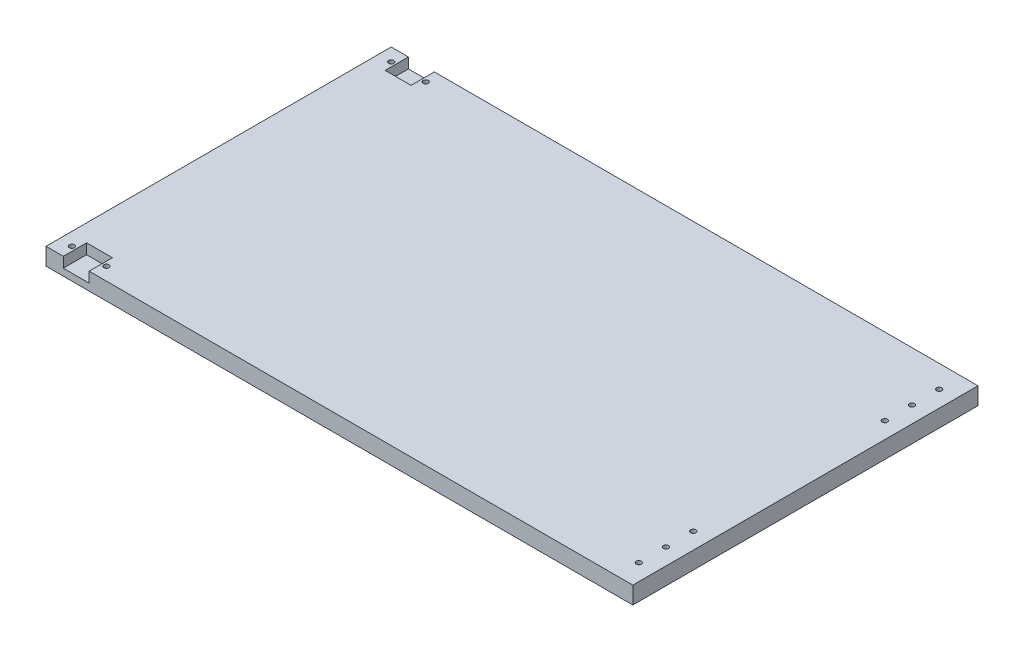
ISO-10303-21;
HEADER;
FILE_DESCRIPTION(('STEP AP214'),'2;1');
FILE_NAME('part.step','',(''),(''),'','','');
FILE_SCHEMA(('AUTOMOTIVE_DESIGN { 1 0 10303 214 1 1 1 1 }'));
ENDSEC;
DATA;
#1=APPLICATION_CONTEXT('core data for automotive mechanical design processes');
#2=APPLICATION_PROTOCOL_DEFINITION('international standard','automotive_design',2000,#1);
#3=PRODUCT_CONTEXT('',#1,'mechanical');
#4=PRODUCT('Part','Part','',(#3));
#5=PRODUCT_RELATED_PRODUCT_CATEGORY('part','',(#4));
#6=PRODUCT_DEFINITION_FORMATION('','',#4);
#7=PRODUCT_DEFINITION_CONTEXT('part definition',#1,'design');
#8=PRODUCT_DEFINITION('design','',#6,#7);
#9=PRODUCT_DEFINITION_SHAPE('','',#8);
#10=(LENGTH_UNIT() NAMED_UNIT(*) SI_UNIT(.MILLI.,.METRE.));
#11=(NAMED_UNIT(*) PLANE_ANGLE_UNIT() SI_UNIT($,.RADIAN.));
#12=(NAMED_UNIT(*) SI_UNIT($,.STERADIAN.) SOLID_ANGLE_UNIT());
#13=UNCERTAINTY_MEASURE_WITH_UNIT(LENGTH_MEASURE(1.E-05),#10,'distance_accuracy_value','');
#14=(GEOMETRIC_REPRESENTATION_CONTEXT(3) GLOBAL_UNCERTAINTY_ASSIGNED_CONTEXT((#13)) GLOBAL_UNIT_ASSIGNED_CONTEXT((#10,
#11,#12)) REPRESENTATION_CONTEXT('',''));
#15=CARTESIAN_POINT('',(0.,0.,0.));
#16=DIRECTION('',(0.,0.,1.));
#17=DIRECTION('',(1.,0.,0.));
#18=AXIS2_PLACEMENT_3D('',#15,#16,#17);
#19=CARTESIAN_POINT('',(-340.,20.,-200.));
#20=DIRECTION('',(0.,0.,1.));
#21=DIRECTION('',(1.,0.,0.));
#22=AXIS2_PLACEMENT_3D('',#19,#20,#21);
#23=PLANE('',#22);
#24=DIRECTION('',(0.,1.,0.));
#25=VECTOR('',#24,1.);
#26=CARTESIAN_POINT('',(-320.,8.,-200.));
#27=LINE('',#26,#25);
#28=CARTESIAN_POINT('',(-320.,8.,-200.));
#29=VERTEX_POINT('',#28);
#30=CARTESIAN_POINT('',(-320.,20.,-200.));
#31=VERTEX_POINT('',#30);
#32=EDGE_CURVE('E163',#29,#31,#27,.T.);
#33=ORIENTED_EDGE('',*,*,#32,.F.);
#34=DIRECTION('',(1.,0.,0.));
#35=VECTOR('',#34,1.);
#36=CARTESIAN_POINT('',(-320.,8.,-200.));
#37=LINE('',#36,#35);
#38=CARTESIAN_POINT('',(-290.,8.,-200.));
#39=VERTEX_POINT('',#38);
#40=EDGE_CURVE('E145',#29,#39,#37,.T.);
#41=ORIENTED_EDGE('',*,*,#40,.T.);
#42=DIRECTION('',(0.,1.,0.));
#43=VECTOR('',#42,1.);
#44=CARTESIAN_POINT('',(-290.,8.,-200.));
#45=LINE('',#44,#43);
#46=CARTESIAN_POINT('',(-290.,20.,-200.));
#47=VERTEX_POINT('',#46);
#48=EDGE_CURVE('E166',#39,#47,#45,.T.);
#49=ORIENTED_EDGE('',*,*,#48,.T.);
#50=DIRECTION('',(-1.,0.,0.));
#51=VECTOR('',#50,1.);
#52=CARTESIAN_POINT('',(-340.,20.,-200.));
#53=LINE('',#52,#51);
#54=CARTESIAN_POINT('',(340.,20.,-200.));
#55=VERTEX_POINT('',#54);
#56=EDGE_CURVE('E202',#55,#47,#53,.T.);
#57=ORIENTED_EDGE('',*,*,#56,.F.);
#58=DIRECTION('',(0.,-1.,0.));
#59=VECTOR('',#58,1.);
#60=CARTESIAN_POINT('',(340.,20.,-200.));
#61=LINE('',#60,#59);
#62=CARTESIAN_POINT('',(340.,0.,-200.));
#63=VERTEX_POINT('',#62);
#64=EDGE_CURVE('E11',#55,#63,#61,.T.);
#65=ORIENTED_EDGE('',*,*,#64,.T.);
#66=DIRECTION('',(-1.,0.,0.));
#67=VECTOR('',#66,1.);
#68=CARTESIAN_POINT('',(-340.,0.,-200.));
#69=LINE('',#68,#67);
#70=CARTESIAN_POINT('',(-340.,0.,-200.));
#71=VERTEX_POINT('',#70);
#72=EDGE_CURVE('E214',#63,#71,#69,.T.);
#73=ORIENTED_EDGE('',*,*,#72,.T.);
#74=DIRECTION('',(0.,-1.,0.));
#75=VECTOR('',#74,1.);
#76=CARTESIAN_POINT('',(-340.,20.,-200.));
#77=LINE('',#76,#75);
#78=CARTESIAN_POINT('',(-340.,20.,-200.));
#79=VERTEX_POINT('',#78);
#80=EDGE_CURVE('E47',#79,#71,#77,.T.);
#81=ORIENTED_EDGE('',*,*,#80,.F.);
#82=EDGE_CURVE('E200',#31,#79,#53,.T.);
#83=ORIENTED_EDGE('',*,*,#82,.F.);
#84=EDGE_LOOP('',(#33,#41,#49,#57,#65,#73,#81,#83));
#85=FACE_BOUND('',#84,.T.);
#86=ADVANCED_FACE('F39',(#85),#23,.F.);
#87=CARTESIAN_POINT('',(0.,20.,0.));
#88=DIRECTION('',(0.,1.,0.));
#89=DIRECTION('',(0.,0.,1.));
#90=AXIS2_PLACEMENT_3D('',#87,#88,#89);
#91=PLANE('',#90);
#92=CARTESIAN_POINT('',(-325.,20.,-185.));
#93=DIRECTION('',(0.,-1.,0.));
#94=DIRECTION('',(0.,0.,-1.));
#95=AXIS2_PLACEMENT_3D('',#92,#93,#94);
#96=CIRCLE('',#95,2.99999999999999);
#97=CARTESIAN_POINT('',(-325.,20.,-188.));
#98=VERTEX_POINT('',#97);
#99=EDGE_CURVE('E657',#98,#98,#96,.T.);
#100=ORIENTED_EDGE('',*,*,#99,.T.);
#101=EDGE_LOOP('',(#100));
#102=FACE_BOUND('',#101,.T.);
#103=CARTESIAN_POINT('',(-285.,20.,-185.));
#104=DIRECTION('',(0.,-1.,0.));
#105=DIRECTION('',(0.,0.,-1.));
#106=AXIS2_PLACEMENT_3D('',#103,#104,#105);
#107=CIRCLE('',#106,2.99999999999999);
#108=CARTESIAN_POINT('',(-285.,20.,-188.));
#109=VERTEX_POINT('',#108);
#110=EDGE_CURVE('E668',#109,#109,#107,.T.);
#111=ORIENTED_EDGE('',*,*,#110,.T.);
#112=EDGE_LOOP('',(#111));
#113=FACE_BOUND('',#112,.T.);
#114=CARTESIAN_POINT('',(-325.,20.,185.));
#115=DIRECTION('',(0.,1.,0.));
#116=DIRECTION('',(0.,0.,1.));
#117=AXIS2_PLACEMENT_3D('',#114,#115,#116);
#118=CIRCLE('',#117,2.99999999999999);
#119=CARTESIAN_POINT('',(-325.,20.,188.));
#120=VERTEX_POINT('',#119);
#121=EDGE_CURVE('E675',#120,#120,#118,.T.);
#122=ORIENTED_EDGE('',*,*,#121,.F.);
#123=EDGE_LOOP('',(#122));
#124=FACE_BOUND('',#123,.T.);
#125=CARTESIAN_POINT('',(-285.,20.,185.));
#126=DIRECTION('',(0.,1.,0.));
#127=DIRECTION('',(0.,0.,1.));
#128=AXIS2_PLACEMENT_3D('',#125,#126,#127);
#129=CIRCLE('',#128,2.99999999999999);
#130=CARTESIAN_POINT('',(-285.,20.,188.));
#131=VERTEX_POINT('',#130);
#132=EDGE_CURVE('E660',#131,#131,#129,.T.);
#133=ORIENTED_EDGE('',*,*,#132,.F.);
#134=EDGE_LOOP('',(#133));
#135=FACE_BOUND('',#134,.T.);
#136=CARTESIAN_POINT('',(321.,20.,-174.));
#137=DIRECTION('',(0.,-1.,0.));
#138=DIRECTION('',(0.,0.,-1.));
#139=AXIS2_PLACEMENT_3D('',#136,#137,#138);
#140=CIRCLE('',#139,2.99999999999999);
#141=CARTESIAN_POINT('',(321.,20.,-177.));
#142=VERTEX_POINT('',#141);
#143=EDGE_CURVE('E683',#142,#142,#140,.T.);
#144=ORIENTED_EDGE('',*,*,#143,.T.);
#145=EDGE_LOOP('',(#144));
#146=FACE_BOUND('',#145,.T.);
#147=CARTESIAN_POINT('',(321.,20.,-142.5));
#148=DIRECTION('',(0.,-1.,0.));
#149=DIRECTION('',(0.,0.,-1.));
#150=AXIS2_PLACEMENT_3D('',#147,#148,#149);
#151=CIRCLE('',#150,2.99999999999999);
#152=CARTESIAN_POINT('',(321.,20.,-145.5));
#153=VERTEX_POINT('',#152);
#154=EDGE_CURVE('E689',#153,#153,#151,.T.);
#155=ORIENTED_EDGE('',*,*,#154,.T.);
#156=EDGE_LOOP('',(#155));
#157=FACE_BOUND('',#156,.T.);
#158=CARTESIAN_POINT('',(321.,20.,-111.));
#159=DIRECTION('',(0.,-1.,0.));
#160=DIRECTION('',(0.,0.,-1.));
#161=AXIS2_PLACEMENT_3D('',#158,#159,#160);
#162=CIRCLE('',#161,2.99999999999999);
#163=CARTESIAN_POINT('',(321.,20.,-114.));
#164=VERTEX_POINT('',#163);
#165=EDGE_CURVE('E674',#164,#164,#162,.T.);
#166=ORIENTED_EDGE('',*,*,#165,.T.);
#167=EDGE_LOOP('',(#166));
#168=FACE_BOUND('',#167,.T.);
#169=CARTESIAN_POINT('',(321.,20.,174.));
#170=DIRECTION('',(0.,1.,0.));
#171=DIRECTION('',(0.,0.,1.));
#172=AXIS2_PLACEMENT_3D('',#169,#170,#171);
#173=CIRCLE('',#172,2.99999999999999);
#174=CARTESIAN_POINT('',(321.,20.,177.));
#175=VERTEX_POINT('',#174);
#176=EDGE_CURVE('E699',#175,#175,#173,.T.);
#177=ORIENTED_EDGE('',*,*,#176,.F.);
#178=EDGE_LOOP('',(#177));
#179=FACE_BOUND('',#178,.T.);
#180=CARTESIAN_POINT('',(321.,20.,142.5));
#181=DIRECTION('',(0.,1.,0.));
#182=DIRECTION('',(0.,0.,1.));
#183=AXIS2_PLACEMENT_3D('',#180,#181,#182);
#184=CIRCLE('',#183,2.99999999999999);
#185=CARTESIAN_POINT('',(321.,20.,145.5));
#186=VERTEX_POINT('',#185);
#187=EDGE_CURVE('E702',#186,#186,#184,.T.);
#188=ORIENTED_EDGE('',*,*,#187,.F.);
#189=EDGE_LOOP('',(#188));
#190=FACE_BOUND('',#189,.T.);
#191=CARTESIAN_POINT('',(321.,20.,111.));
#192=DIRECTION('',(0.,1.,0.));
#193=DIRECTION('',(0.,0.,1.));
#194=AXIS2_PLACEMENT_3D('',#191,#192,#193);
#195=CIRCLE('',#194,2.99999999999999);
#196=CARTESIAN_POINT('',(321.,20.,114.));
#197=VERTEX_POINT('',#196);
#198=EDGE_CURVE('E707',#197,#197,#195,.T.);
#199=ORIENTED_EDGE('',*,*,#198,.F.);
#200=EDGE_LOOP('',(#199));
#201=FACE_BOUND('',#200,.T.);
#202=DIRECTION('',(-1.,0.,0.));
#203=VECTOR('',#202,1.);
#204=CARTESIAN_POINT('',(-320.,20.,-173.));
#205=LINE('',#204,#203);
#206=CARTESIAN_POINT('',(-290.,20.,-173.));
#207=VERTEX_POINT('',#206);
#208=CARTESIAN_POINT('',(-320.,20.,-173.));
#209=VERTEX_POINT('',#208);
#210=EDGE_CURVE('E152',#207,#209,#205,.T.);
#211=ORIENTED_EDGE('',*,*,#210,.T.);
#212=DIRECTION('',(0.,0.,-1.));
#213=VECTOR('',#212,1.);
#214=CARTESIAN_POINT('',(-320.,20.,-200.));
#215=LINE('',#214,#213);
#216=EDGE_CURVE('E54',#209,#31,#215,.T.);
#217=ORIENTED_EDGE('',*,*,#216,.T.);
#218=ORIENTED_EDGE('',*,*,#82,.T.);
#219=DIRECTION('',(0.,0.,1.));
#220=VECTOR('',#219,1.);
#221=CARTESIAN_POINT('',(-340.,20.,-200.));
#222=LINE('',#221,#220);
#223=CARTESIAN_POINT('',(-340.,20.,200.));
#224=VERTEX_POINT('',#223);
#225=EDGE_CURVE('E205',#79,#224,#222,.T.);
#226=ORIENTED_EDGE('',*,*,#225,.T.);
#227=DIRECTION('',(1.,0.,0.));
#228=VECTOR('',#227,1.);
#229=CARTESIAN_POINT('',(-340.,20.,200.));
#230=LINE('',#229,#228);
#231=CARTESIAN_POINT('',(-320.,20.,200.));
#232=VERTEX_POINT('',#231);
#233=EDGE_CURVE('E208',#224,#232,#230,.T.);
#234=ORIENTED_EDGE('',*,*,#233,.T.);
#235=DIRECTION('',(0.,0.,1.));
#236=VECTOR('',#235,1.);
#237=CARTESIAN_POINT('',(-320.,20.,200.));
#238=LINE('',#237,#236);
#239=CARTESIAN_POINT('',(-320.,20.,173.));
#240=VERTEX_POINT('',#239);
#241=EDGE_CURVE('E165',#240,#232,#238,.T.);
#242=ORIENTED_EDGE('',*,*,#241,.F.);
#243=DIRECTION('',(-1.,0.,0.));
#244=VECTOR('',#243,1.);
#245=CARTESIAN_POINT('',(-320.,20.,173.));
#246=LINE('',#245,#244);
#247=CARTESIAN_POINT('',(-290.,20.,173.));
#248=VERTEX_POINT('',#247);
#249=EDGE_CURVE('E174',#248,#240,#246,.T.);
#250=ORIENTED_EDGE('',*,*,#249,.F.);
#251=DIRECTION('',(0.,0.,-1.));
#252=VECTOR('',#251,1.);
#253=CARTESIAN_POINT('',(-290.,20.,200.));
#254=LINE('',#253,#252);
#255=CARTESIAN_POINT('',(-290.,20.,200.));
#256=VERTEX_POINT('',#255);
#257=EDGE_CURVE('E185',#256,#248,#254,.T.);
#258=ORIENTED_EDGE('',*,*,#257,.F.);
#259=CARTESIAN_POINT('',(340.,20.,200.));
#260=VERTEX_POINT('',#259);
#261=EDGE_CURVE('E207',#256,#260,#230,.T.);
#262=ORIENTED_EDGE('',*,*,#261,.T.);
#263=DIRECTION('',(0.,0.,-1.));
#264=VECTOR('',#263,1.);
#265=CARTESIAN_POINT('',(340.,20.,-200.));
#266=LINE('',#265,#264);
#267=EDGE_CURVE('E197',#260,#55,#266,.T.);
#268=ORIENTED_EDGE('',*,*,#267,.T.);
#269=ORIENTED_EDGE('',*,*,#56,.T.);
#270=DIRECTION('',(0.,0.,1.));
#271=VECTOR('',#270,1.);
#272=CARTESIAN_POINT('',(-290.,20.,-200.));
#273=LINE('',#272,#271);
#274=EDGE_CURVE('E149',#47,#207,#273,.T.);
#275=ORIENTED_EDGE('',*,*,#274,.T.);
#276=EDGE_LOOP('',(#211,#217,#218,#226,#234,#242,#250,#258,#262,#268,#269,#275));
#277=FACE_BOUND('',#276,.T.);
#278=ADVANCED_FACE('F246',(#102,#113,#124,#135,#146,#157,#168,#179,#190,#201,#277),#91,.T.);
#279=CARTESIAN_POINT('',(340.,20.,-200.));
#280=DIRECTION('',(-1.,0.,0.));
#281=DIRECTION('',(0.,0.,1.));
#282=AXIS2_PLACEMENT_3D('',#279,#280,#281);
#283=PLANE('',#282);
#284=DIRECTION('',(0.,0.,-1.));
#285=VECTOR('',#284,1.);
#286=CARTESIAN_POINT('',(340.,0.,-200.));
#287=LINE('',#286,#285);
#288=CARTESIAN_POINT('',(340.,0.,200.));
#289=VERTEX_POINT('',#288);
#290=EDGE_CURVE('E191',#289,#63,#287,.T.);
#291=ORIENTED_EDGE('',*,*,#290,.T.);
#292=ORIENTED_EDGE('',*,*,#64,.F.);
#293=ORIENTED_EDGE('',*,*,#267,.F.);
#294=DIRECTION('',(0.,-1.,0.));
#295=VECTOR('',#294,1.);
#296=CARTESIAN_POINT('',(340.,20.,200.));
#297=LINE('',#296,#295);
#298=EDGE_CURVE('E211',#260,#289,#297,.T.);
#299=ORIENTED_EDGE('',*,*,#298,.T.);
#300=EDGE_LOOP('',(#291,#292,#293,#299));
#301=FACE_BOUND('',#300,.T.);
#302=ADVANCED_FACE('F41',(#301),#283,.F.);
#303=CARTESIAN_POINT('',(-340.,20.,-200.));
#304=DIRECTION('',(1.,0.,0.));
#305=DIRECTION('',(0.,0.,-1.));
#306=AXIS2_PLACEMENT_3D('',#303,#304,#305);
#307=PLANE('',#306);
#308=DIRECTION('',(0.,0.,1.));
#309=VECTOR('',#308,1.);
#310=CARTESIAN_POINT('',(-340.,0.,-200.));
#311=LINE('',#310,#309);
#312=CARTESIAN_POINT('',(-340.,0.,200.));
#313=VERTEX_POINT('',#312);
#314=EDGE_CURVE('E216',#71,#313,#311,.T.);
#315=ORIENTED_EDGE('',*,*,#314,.T.);
#316=DIRECTION('',(0.,-1.,0.));
#317=VECTOR('',#316,1.);
#318=CARTESIAN_POINT('',(-340.,20.,200.));
#319=LINE('',#318,#317);
#320=EDGE_CURVE('E221',#224,#313,#319,.T.);
#321=ORIENTED_EDGE('',*,*,#320,.F.);
#322=ORIENTED_EDGE('',*,*,#225,.F.);
#323=ORIENTED_EDGE('',*,*,#80,.T.);
#324=EDGE_LOOP('',(#315,#321,#322,#323));
#325=FACE_BOUND('',#324,.T.);
#326=ADVANCED_FACE('F228',(#325),#307,.F.);
#327=CARTESIAN_POINT('',(-340.,20.,200.));
#328=DIRECTION('',(0.,0.,-1.));
#329=DIRECTION('',(-1.,0.,0.));
#330=AXIS2_PLACEMENT_3D('',#327,#328,#329);
#331=PLANE('',#330);
#332=DIRECTION('',(1.,0.,0.));
#333=VECTOR('',#332,1.);
#334=CARTESIAN_POINT('',(-320.,8.,200.));
#335=LINE('',#334,#333);
#336=CARTESIAN_POINT('',(-320.,8.,200.));
#337=VERTEX_POINT('',#336);
#338=CARTESIAN_POINT('',(-290.,8.,200.));
#339=VERTEX_POINT('',#338);
#340=EDGE_CURVE('E173',#337,#339,#335,.T.);
#341=ORIENTED_EDGE('',*,*,#340,.F.);
#342=DIRECTION('',(0.,1.,0.));
#343=VECTOR('',#342,1.);
#344=CARTESIAN_POINT('',(-320.,8.,200.));
#345=LINE('',#344,#343);
#346=EDGE_CURVE('E183',#337,#232,#345,.T.);
#347=ORIENTED_EDGE('',*,*,#346,.T.);
#348=ORIENTED_EDGE('',*,*,#233,.F.);
#349=ORIENTED_EDGE('',*,*,#320,.T.);
#350=DIRECTION('',(1.,0.,0.));
#351=VECTOR('',#350,1.);
#352=CARTESIAN_POINT('',(-340.,0.,200.));
#353=LINE('',#352,#351);
#354=EDGE_CURVE('E201',#313,#289,#353,.T.);
#355=ORIENTED_EDGE('',*,*,#354,.T.);
#356=ORIENTED_EDGE('',*,*,#298,.F.);
#357=ORIENTED_EDGE('',*,*,#261,.F.);
#358=DIRECTION('',(0.,1.,0.));
#359=VECTOR('',#358,1.);
#360=CARTESIAN_POINT('',(-290.,8.,200.));
#361=LINE('',#360,#359);
#362=EDGE_CURVE('E62',#339,#256,#361,.T.);
#363=ORIENTED_EDGE('',*,*,#362,.F.);
#364=EDGE_LOOP('',(#341,#347,#348,#349,#355,#356,#357,#363));
#365=FACE_BOUND('',#364,.T.);
#366=ADVANCED_FACE('F239',(#365),#331,.F.);
#367=CARTESIAN_POINT('',(0.,0.,0.));
#368=DIRECTION('',(0.,1.,0.));
#369=DIRECTION('',(0.,0.,1.));
#370=AXIS2_PLACEMENT_3D('',#367,#368,#369);
#371=PLANE('',#370);
#372=ORIENTED_EDGE('',*,*,#290,.F.);
#373=ORIENTED_EDGE('',*,*,#354,.F.);
#374=ORIENTED_EDGE('',*,*,#314,.F.);
#375=ORIENTED_EDGE('',*,*,#72,.F.);
#376=EDGE_LOOP('',(#372,#373,#374,#375));
#377=FACE_BOUND('',#376,.T.);
#378=ADVANCED_FACE('F235',(#377),#371,.F.);
#379=CARTESIAN_POINT('',(-320.,8.,200.));
#380=DIRECTION('',(-1.,0.,0.));
#381=DIRECTION('',(0.,0.,1.));
#382=AXIS2_PLACEMENT_3D('',#379,#380,#381);
#383=PLANE('',#382);
#384=ORIENTED_EDGE('',*,*,#241,.T.);
#385=ORIENTED_EDGE('',*,*,#346,.F.);
#386=DIRECTION('',(0.,0.,1.));
#387=VECTOR('',#386,1.);
#388=CARTESIAN_POINT('',(-320.,8.,200.));
#389=LINE('',#388,#387);
#390=CARTESIAN_POINT('',(-320.,8.,173.));
#391=VERTEX_POINT('',#390);
#392=EDGE_CURVE('E170',#391,#337,#389,.T.);
#393=ORIENTED_EDGE('',*,*,#392,.F.);
#394=DIRECTION('',(0.,1.,0.));
#395=VECTOR('',#394,1.);
#396=CARTESIAN_POINT('',(-320.,8.,173.));
#397=LINE('',#396,#395);
#398=EDGE_CURVE('E189',#391,#240,#397,.T.);
#399=ORIENTED_EDGE('',*,*,#398,.T.);
#400=EDGE_LOOP('',(#384,#385,#393,#399));
#401=FACE_BOUND('',#400,.T.);
#402=ADVANCED_FACE('F253',(#401),#383,.F.);
#403=CARTESIAN_POINT('',(-320.,8.,173.));
#404=DIRECTION('',(0.,0.,-1.));
#405=DIRECTION('',(-1.,0.,0.));
#406=AXIS2_PLACEMENT_3D('',#403,#404,#405);
#407=PLANE('',#406);
#408=ORIENTED_EDGE('',*,*,#249,.T.);
#409=ORIENTED_EDGE('',*,*,#398,.F.);
#410=DIRECTION('',(-1.,0.,0.));
#411=VECTOR('',#410,1.);
#412=CARTESIAN_POINT('',(-320.,8.,173.));
#413=LINE('',#412,#411);
#414=CARTESIAN_POINT('',(-290.,8.,173.));
#415=VERTEX_POINT('',#414);
#416=EDGE_CURVE('E180',#415,#391,#413,.T.);
#417=ORIENTED_EDGE('',*,*,#416,.F.);
#418=DIRECTION('',(0.,1.,0.));
#419=VECTOR('',#418,1.);
#420=CARTESIAN_POINT('',(-290.,8.,173.));
#421=LINE('',#420,#419);
#422=EDGE_CURVE('E192',#415,#248,#421,.T.);
#423=ORIENTED_EDGE('',*,*,#422,.T.);
#424=EDGE_LOOP('',(#408,#409,#417,#423));
#425=FACE_BOUND('',#424,.T.);
#426=ADVANCED_FACE('F281',(#425),#407,.F.);
#427=CARTESIAN_POINT('',(-290.,8.,200.));
#428=DIRECTION('',(1.,0.,0.));
#429=DIRECTION('',(0.,0.,-1.));
#430=AXIS2_PLACEMENT_3D('',#427,#428,#429);
#431=PLANE('',#430);
#432=ORIENTED_EDGE('',*,*,#257,.T.);
#433=ORIENTED_EDGE('',*,*,#422,.F.);
#434=DIRECTION('',(0.,0.,-1.));
#435=VECTOR('',#434,1.);
#436=CARTESIAN_POINT('',(-290.,8.,200.));
#437=LINE('',#436,#435);
#438=EDGE_CURVE('E177',#339,#415,#437,.T.);
#439=ORIENTED_EDGE('',*,*,#438,.F.);
#440=ORIENTED_EDGE('',*,*,#362,.T.);
#441=EDGE_LOOP('',(#432,#433,#439,#440));
#442=FACE_BOUND('',#441,.T.);
#443=ADVANCED_FACE('F282',(#442),#431,.F.);
#444=CARTESIAN_POINT('',(0.,8.,0.));
#445=DIRECTION('',(0.,-1.,0.));
#446=DIRECTION('',(0.,0.,-1.));
#447=AXIS2_PLACEMENT_3D('',#444,#445,#446);
#448=PLANE('',#447);
#449=ORIENTED_EDGE('',*,*,#392,.T.);
#450=ORIENTED_EDGE('',*,*,#340,.T.);
#451=ORIENTED_EDGE('',*,*,#438,.T.);
#452=ORIENTED_EDGE('',*,*,#416,.T.);
#453=EDGE_LOOP('',(#449,#450,#451,#452));
#454=FACE_BOUND('',#453,.T.);
#455=ADVANCED_FACE('F249',(#454),#448,.F.);
#456=CARTESIAN_POINT('',(-320.,8.,-200.));
#457=DIRECTION('',(1.,0.,0.));
#458=DIRECTION('',(0.,0.,-1.));
#459=AXIS2_PLACEMENT_3D('',#456,#457,#458);
#460=PLANE('',#459);
#461=ORIENTED_EDGE('',*,*,#216,.F.);
#462=DIRECTION('',(0.,1.,0.));
#463=VECTOR('',#462,1.);
#464=CARTESIAN_POINT('',(-320.,8.,-173.));
#465=LINE('',#464,#463);
#466=CARTESIAN_POINT('',(-320.,8.,-173.));
#467=VERTEX_POINT('',#466);
#468=EDGE_CURVE('E133',#467,#209,#465,.T.);
#469=ORIENTED_EDGE('',*,*,#468,.F.);
#470=DIRECTION('',(0.,0.,-1.));
#471=VECTOR('',#470,1.);
#472=CARTESIAN_POINT('',(-320.,8.,-200.));
#473=LINE('',#472,#471);
#474=EDGE_CURVE('E140',#467,#29,#473,.T.);
#475=ORIENTED_EDGE('',*,*,#474,.T.);
#476=ORIENTED_EDGE('',*,*,#32,.T.);
#477=EDGE_LOOP('',(#461,#469,#475,#476));
#478=FACE_BOUND('',#477,.T.);
#479=ADVANCED_FACE('F143',(#478),#460,.T.);
#480=CARTESIAN_POINT('',(-290.,8.,-200.));
#481=DIRECTION('',(-1.,0.,0.));
#482=DIRECTION('',(0.,0.,1.));
#483=AXIS2_PLACEMENT_3D('',#480,#481,#482);
#484=PLANE('',#483);
#485=ORIENTED_EDGE('',*,*,#274,.F.);
#486=ORIENTED_EDGE('',*,*,#48,.F.);
#487=DIRECTION('',(0.,0.,1.));
#488=VECTOR('',#487,1.);
#489=CARTESIAN_POINT('',(-290.,8.,-200.));
#490=LINE('',#489,#488);
#491=CARTESIAN_POINT('',(-290.,8.,-173.));
#492=VERTEX_POINT('',#491);
#493=EDGE_CURVE('E139',#39,#492,#490,.T.);
#494=ORIENTED_EDGE('',*,*,#493,.T.);
#495=DIRECTION('',(0.,1.,0.));
#496=VECTOR('',#495,1.);
#497=CARTESIAN_POINT('',(-290.,8.,-173.));
#498=LINE('',#497,#496);
#499=EDGE_CURVE('E135',#492,#207,#498,.T.);
#500=ORIENTED_EDGE('',*,*,#499,.T.);
#501=EDGE_LOOP('',(#485,#486,#494,#500));
#502=FACE_BOUND('',#501,.T.);
#503=ADVANCED_FACE('F256',(#502),#484,.T.);
#504=CARTESIAN_POINT('',(-320.,8.,-173.));
#505=DIRECTION('',(0.,0.,-1.));
#506=DIRECTION('',(-1.,0.,0.));
#507=AXIS2_PLACEMENT_3D('',#504,#505,#506);
#508=PLANE('',#507);
#509=ORIENTED_EDGE('',*,*,#210,.F.);
#510=ORIENTED_EDGE('',*,*,#499,.F.);
#511=DIRECTION('',(-1.,0.,0.));
#512=VECTOR('',#511,1.);
#513=CARTESIAN_POINT('',(-320.,8.,-173.));
#514=LINE('',#513,#512);
#515=EDGE_CURVE('E130',#492,#467,#514,.T.);
#516=ORIENTED_EDGE('',*,*,#515,.T.);
#517=ORIENTED_EDGE('',*,*,#468,.T.);
#518=EDGE_LOOP('',(#509,#510,#516,#517));
#519=FACE_BOUND('',#518,.T.);
#520=ADVANCED_FACE('F132',(#519),#508,.T.);
#521=CARTESIAN_POINT('',(0.,8.,0.));
#522=DIRECTION('',(0.,-1.,0.));
#523=DIRECTION('',(0.,0.,1.));
#524=AXIS2_PLACEMENT_3D('',#521,#522,#523);
#525=PLANE('',#524);
#526=ORIENTED_EDGE('',*,*,#474,.F.);
#527=ORIENTED_EDGE('',*,*,#515,.F.);
#528=ORIENTED_EDGE('',*,*,#493,.F.);
#529=ORIENTED_EDGE('',*,*,#40,.F.);
#530=EDGE_LOOP('',(#526,#527,#528,#529));
#531=FACE_BOUND('',#530,.T.);
#532=ADVANCED_FACE('F147',(#531),#525,.F.);
#533=CARTESIAN_POINT('',(321.,7.,111.));
#534=DIRECTION('',(0.,1.,0.));
#535=DIRECTION('',(0.,0.,1.));
#536=AXIS2_PLACEMENT_3D('',#533,#534,#535);
#537=CYLINDRICAL_SURFACE('',#536,2.99999999999999);
#538=CARTESIAN_POINT('',(321.,7.,111.));
#539=DIRECTION('',(0.,1.,0.));
#540=DIRECTION('',(0.,0.,1.));
#541=AXIS2_PLACEMENT_3D('',#538,#539,#540);
#542=CIRCLE('',#541,2.99999999999999);
#543=CARTESIAN_POINT('',(321.,7.,114.));
#544=VERTEX_POINT('',#543);
#545=EDGE_CURVE('E155',#544,#544,#542,.T.);
#546=ORIENTED_EDGE('',*,*,#545,.F.);
#547=EDGE_LOOP('',(#546));
#548=FACE_BOUND('',#547,.T.);
#549=ORIENTED_EDGE('',*,*,#198,.T.);
#550=EDGE_LOOP('',(#549));
#551=FACE_BOUND('',#550,.T.);
#552=ADVANCED_FACE('F322',(#548,#551),#537,.F.);
#553=CARTESIAN_POINT('',(321.,7.,111.));
#554=DIRECTION('',(0.,1.,0.));
#555=DIRECTION('',(0.,0.,1.));
#556=AXIS2_PLACEMENT_3D('',#553,#554,#555);
#557=PLANE('',#556);
#558=ORIENTED_EDGE('',*,*,#545,.T.);
#559=EDGE_LOOP('',(#558));
#560=FACE_BOUND('',#559,.T.);
#561=ADVANCED_FACE('F331',(#560),#557,.T.);
#562=CARTESIAN_POINT('',(321.,7.,142.5));
#563=DIRECTION('',(0.,1.,0.));
#564=DIRECTION('',(0.,0.,1.));
#565=AXIS2_PLACEMENT_3D('',#562,#563,#564);
#566=CYLINDRICAL_SURFACE('',#565,2.99999999999999);
#567=CARTESIAN_POINT('',(321.,7.,142.5));
#568=DIRECTION('',(0.,1.,0.));
#569=DIRECTION('',(0.,0.,1.));
#570=AXIS2_PLACEMENT_3D('',#567,#568,#569);
#571=CIRCLE('',#570,2.99999999999999);
#572=CARTESIAN_POINT('',(321.,7.,145.5));
#573=VERTEX_POINT('',#572);
#574=EDGE_CURVE('E705',#573,#573,#571,.T.);
#575=ORIENTED_EDGE('',*,*,#574,.F.);
#576=EDGE_LOOP('',(#575));
#577=FACE_BOUND('',#576,.T.);
#578=ORIENTED_EDGE('',*,*,#187,.T.);
#579=EDGE_LOOP('',(#578));
#580=FACE_BOUND('',#579,.T.);
#581=ADVANCED_FACE('F342',(#577,#580),#566,.F.);
#582=CARTESIAN_POINT('',(321.,7.,142.5));
#583=DIRECTION('',(0.,1.,0.));
#584=DIRECTION('',(0.,0.,1.));
#585=AXIS2_PLACEMENT_3D('',#582,#583,#584);
#586=PLANE('',#585);
#587=ORIENTED_EDGE('',*,*,#574,.T.);
#588=EDGE_LOOP('',(#587));
#589=FACE_BOUND('',#588,.T.);
#590=ADVANCED_FACE('F353',(#589),#586,.T.);
#591=CARTESIAN_POINT('',(321.,7.,174.));
#592=DIRECTION('',(0.,1.,0.));
#593=DIRECTION('',(0.,0.,1.));
#594=AXIS2_PLACEMENT_3D('',#591,#592,#593);
#595=CYLINDRICAL_SURFACE('',#594,2.99999999999999);
#596=CARTESIAN_POINT('',(321.,7.,174.));
#597=DIRECTION('',(0.,1.,0.));
#598=DIRECTION('',(0.,0.,1.));
#599=AXIS2_PLACEMENT_3D('',#596,#597,#598);
#600=CIRCLE('',#599,2.99999999999999);
#601=CARTESIAN_POINT('',(321.,7.,177.));
#602=VERTEX_POINT('',#601);
#603=EDGE_CURVE('E161',#602,#602,#600,.T.);
#604=ORIENTED_EDGE('',*,*,#603,.F.);
#605=EDGE_LOOP('',(#604));
#606=FACE_BOUND('',#605,.T.);
#607=ORIENTED_EDGE('',*,*,#176,.T.);
#608=EDGE_LOOP('',(#607));
#609=FACE_BOUND('',#608,.T.);
#610=ADVANCED_FACE('F364',(#606,#609),#595,.F.);
#611=CARTESIAN_POINT('',(321.,7.,174.));
#612=DIRECTION('',(0.,1.,0.));
#613=DIRECTION('',(0.,0.,1.));
#614=AXIS2_PLACEMENT_3D('',#611,#612,#613);
#615=PLANE('',#614);
#616=ORIENTED_EDGE('',*,*,#603,.T.);
#617=EDGE_LOOP('',(#616));
#618=FACE_BOUND('',#617,.T.);
#619=ADVANCED_FACE('F375',(#618),#615,.T.);
#620=CARTESIAN_POINT('',(321.,7.,-111.));
#621=DIRECTION('',(0.,1.,0.));
#622=DIRECTION('',(0.,0.,1.));
#623=AXIS2_PLACEMENT_3D('',#620,#621,#622);
#624=CYLINDRICAL_SURFACE('',#623,2.99999999999999);
#625=CARTESIAN_POINT('',(321.,7.,-111.));
#626=DIRECTION('',(0.,-1.,0.));
#627=DIRECTION('',(0.,0.,-1.));
#628=AXIS2_PLACEMENT_3D('',#625,#626,#627);
#629=CIRCLE('',#628,2.99999999999999);
#630=CARTESIAN_POINT('',(321.,7.,-114.));
#631=VERTEX_POINT('',#630);
#632=EDGE_CURVE('E692',#631,#631,#629,.T.);
#633=ORIENTED_EDGE('',*,*,#632,.T.);
#634=EDGE_LOOP('',(#633));
#635=FACE_BOUND('',#634,.T.);
#636=ORIENTED_EDGE('',*,*,#165,.F.);
#637=EDGE_LOOP('',(#636));
#638=FACE_BOUND('',#637,.T.);
#639=ADVANCED_FACE('F386',(#635,#638),#624,.F.);
#640=CARTESIAN_POINT('',(321.,7.,-111.));
#641=DIRECTION('',(0.,1.,0.));
#642=DIRECTION('',(0.,0.,-1.));
#643=AXIS2_PLACEMENT_3D('',#640,#641,#642);
#644=PLANE('',#643);
#645=ORIENTED_EDGE('',*,*,#632,.F.);
#646=EDGE_LOOP('',(#645));
#647=FACE_BOUND('',#646,.T.);
#648=ADVANCED_FACE('F397',(#647),#644,.T.);
#649=CARTESIAN_POINT('',(321.,7.,-142.5));
#650=DIRECTION('',(0.,1.,0.));
#651=DIRECTION('',(0.,0.,1.));
#652=AXIS2_PLACEMENT_3D('',#649,#650,#651);
#653=CYLINDRICAL_SURFACE('',#652,2.99999999999999);
#654=CARTESIAN_POINT('',(321.,7.,-142.5));
#655=DIRECTION('',(0.,-1.,0.));
#656=DIRECTION('',(0.,0.,-1.));
#657=AXIS2_PLACEMENT_3D('',#654,#655,#656);
#658=CIRCLE('',#657,2.99999999999999);
#659=CARTESIAN_POINT('',(321.,7.,-145.5));
#660=VERTEX_POINT('',#659);
#661=EDGE_CURVE('E686',#660,#660,#658,.T.);
#662=ORIENTED_EDGE('',*,*,#661,.T.);
#663=EDGE_LOOP('',(#662));
#664=FACE_BOUND('',#663,.T.);
#665=ORIENTED_EDGE('',*,*,#154,.F.);
#666=EDGE_LOOP('',(#665));
#667=FACE_BOUND('',#666,.T.);
#668=ADVANCED_FACE('F408',(#664,#667),#653,.F.);
#669=CARTESIAN_POINT('',(321.,7.,-142.5));
#670=DIRECTION('',(0.,1.,0.));
#671=DIRECTION('',(0.,0.,-1.));
#672=AXIS2_PLACEMENT_3D('',#669,#670,#671);
#673=PLANE('',#672);
#674=ORIENTED_EDGE('',*,*,#661,.F.);
#675=EDGE_LOOP('',(#674));
#676=FACE_BOUND('',#675,.T.);
#677=ADVANCED_FACE('F419',(#676),#673,.T.);
#678=CARTESIAN_POINT('',(321.,7.,-174.));
#679=DIRECTION('',(0.,1.,0.));
#680=DIRECTION('',(0.,0.,1.));
#681=AXIS2_PLACEMENT_3D('',#678,#679,#680);
#682=CYLINDRICAL_SURFACE('',#681,2.99999999999999);
#683=CARTESIAN_POINT('',(321.,7.,-174.));
#684=DIRECTION('',(0.,-1.,0.));
#685=DIRECTION('',(0.,0.,-1.));
#686=AXIS2_PLACEMENT_3D('',#683,#684,#685);
#687=CIRCLE('',#686,2.99999999999999);
#688=CARTESIAN_POINT('',(321.,7.,-177.));
#689=VERTEX_POINT('',#688);
#690=EDGE_CURVE('E680',#689,#689,#687,.T.);
#691=ORIENTED_EDGE('',*,*,#690,.T.);
#692=EDGE_LOOP('',(#691));
#693=FACE_BOUND('',#692,.T.);
#694=ORIENTED_EDGE('',*,*,#143,.F.);
#695=EDGE_LOOP('',(#694));
#696=FACE_BOUND('',#695,.T.);
#697=ADVANCED_FACE('F430',(#693,#696),#682,.F.);
#698=CARTESIAN_POINT('',(321.,7.,-174.));
#699=DIRECTION('',(0.,1.,0.));
#700=DIRECTION('',(0.,0.,-1.));
#701=AXIS2_PLACEMENT_3D('',#698,#699,#700);
#702=PLANE('',#701);
#703=ORIENTED_EDGE('',*,*,#690,.F.);
#704=EDGE_LOOP('',(#703));
#705=FACE_BOUND('',#704,.T.);
#706=ADVANCED_FACE('F441',(#705),#702,.T.);
#707=CARTESIAN_POINT('',(-285.,7.,185.));
#708=DIRECTION('',(0.,1.,0.));
#709=DIRECTION('',(0.,0.,1.));
#710=AXIS2_PLACEMENT_3D('',#707,#708,#709);
#711=CYLINDRICAL_SURFACE('',#710,2.99999999999999);
#712=CARTESIAN_POINT('',(-285.,7.,185.));
#713=DIRECTION('',(0.,1.,0.));
#714=DIRECTION('',(0.,0.,1.));
#715=AXIS2_PLACEMENT_3D('',#712,#713,#714);
#716=CIRCLE('',#715,2.99999999999999);
#717=CARTESIAN_POINT('',(-285.,7.,188.));
#718=VERTEX_POINT('',#717);
#719=EDGE_CURVE('E656',#718,#718,#716,.T.);
#720=ORIENTED_EDGE('',*,*,#719,.F.);
#721=EDGE_LOOP('',(#720));
#722=FACE_BOUND('',#721,.T.);
#723=ORIENTED_EDGE('',*,*,#132,.T.);
#724=EDGE_LOOP('',(#723));
#725=FACE_BOUND('',#724,.T.);
#726=ADVANCED_FACE('F452',(#722,#725),#711,.F.);
#727=CARTESIAN_POINT('',(-285.,7.,185.));
#728=DIRECTION('',(0.,1.,0.));
#729=DIRECTION('',(0.,0.,1.));
#730=AXIS2_PLACEMENT_3D('',#727,#728,#729);
#731=PLANE('',#730);
#732=ORIENTED_EDGE('',*,*,#719,.T.);
#733=EDGE_LOOP('',(#732));
#734=FACE_BOUND('',#733,.T.);
#735=ADVANCED_FACE('F463',(#734),#731,.T.);
#736=CARTESIAN_POINT('',(-325.,7.,185.));
#737=DIRECTION('',(0.,1.,0.));
#738=DIRECTION('',(0.,0.,1.));
#739=AXIS2_PLACEMENT_3D('',#736,#737,#738);
#740=CYLINDRICAL_SURFACE('',#739,2.99999999999999);
#741=CARTESIAN_POINT('',(-325.,7.,185.));
#742=DIRECTION('',(0.,1.,0.));
#743=DIRECTION('',(0.,0.,1.));
#744=AXIS2_PLACEMENT_3D('',#741,#742,#743);
#745=CIRCLE('',#744,2.99999999999999);
#746=CARTESIAN_POINT('',(-325.,7.,188.));
#747=VERTEX_POINT('',#746);
#748=EDGE_CURVE('E671',#747,#747,#745,.T.);
#749=ORIENTED_EDGE('',*,*,#748,.F.);
#750=EDGE_LOOP('',(#749));
#751=FACE_BOUND('',#750,.T.);
#752=ORIENTED_EDGE('',*,*,#121,.T.);
#753=EDGE_LOOP('',(#752));
#754=FACE_BOUND('',#753,.T.);
#755=ADVANCED_FACE('F474',(#751,#754),#740,.F.);
#756=CARTESIAN_POINT('',(-325.,7.,185.));
#757=DIRECTION('',(0.,1.,0.));
#758=DIRECTION('',(0.,0.,1.));
#759=AXIS2_PLACEMENT_3D('',#756,#757,#758);
#760=PLANE('',#759);
#761=ORIENTED_EDGE('',*,*,#748,.T.);
#762=EDGE_LOOP('',(#761));
#763=FACE_BOUND('',#762,.T.);
#764=ADVANCED_FACE('F485',(#763),#760,.T.);
#765=CARTESIAN_POINT('',(-285.,7.,-185.));
#766=DIRECTION('',(0.,1.,0.));
#767=DIRECTION('',(0.,0.,1.));
#768=AXIS2_PLACEMENT_3D('',#765,#766,#767);
#769=CYLINDRICAL_SURFACE('',#768,2.99999999999999);
#770=CARTESIAN_POINT('',(-285.,7.,-185.));
#771=DIRECTION('',(0.,-1.,0.));
#772=DIRECTION('',(0.,0.,-1.));
#773=AXIS2_PLACEMENT_3D('',#770,#771,#772);
#774=CIRCLE('',#773,2.99999999999999);
#775=CARTESIAN_POINT('',(-285.,7.,-188.));
#776=VERTEX_POINT('',#775);
#777=EDGE_CURVE('E663',#776,#776,#774,.T.);
#778=ORIENTED_EDGE('',*,*,#777,.T.);
#779=EDGE_LOOP('',(#778));
#780=FACE_BOUND('',#779,.T.);
#781=ORIENTED_EDGE('',*,*,#110,.F.);
#782=EDGE_LOOP('',(#781));
#783=FACE_BOUND('',#782,.T.);
#784=ADVANCED_FACE('F496',(#780,#783),#769,.F.);
#785=CARTESIAN_POINT('',(-285.,7.,-185.));
#786=DIRECTION('',(0.,1.,0.));
#787=DIRECTION('',(0.,0.,-1.));
#788=AXIS2_PLACEMENT_3D('',#785,#786,#787);
#789=PLANE('',#788);
#790=ORIENTED_EDGE('',*,*,#777,.F.);
#791=EDGE_LOOP('',(#790));
#792=FACE_BOUND('',#791,.T.);
#793=ADVANCED_FACE('F515',(#792),#789,.T.);
#794=CARTESIAN_POINT('',(-325.,7.,-185.));
#795=DIRECTION('',(0.,1.,0.));
#796=DIRECTION('',(0.,0.,1.));
#797=AXIS2_PLACEMENT_3D('',#794,#795,#796);
#798=CYLINDRICAL_SURFACE('',#797,2.99999999999999);
#799=CARTESIAN_POINT('',(-325.,7.,-185.));
#800=DIRECTION('',(0.,-1.,0.));
#801=DIRECTION('',(0.,0.,-1.));
#802=AXIS2_PLACEMENT_3D('',#799,#800,#801);
#803=CIRCLE('',#802,2.99999999999999);
#804=CARTESIAN_POINT('',(-325.,7.,-188.));
#805=VERTEX_POINT('',#804);
#806=EDGE_CURVE('E655',#805,#805,#803,.T.);
#807=ORIENTED_EDGE('',*,*,#806,.T.);
#808=EDGE_LOOP('',(#807));
#809=FACE_BOUND('',#808,.T.);
#810=ORIENTED_EDGE('',*,*,#99,.F.);
#811=EDGE_LOOP('',(#810));
#812=FACE_BOUND('',#811,.T.);
#813=ADVANCED_FACE('F526',(#809,#812),#798,.F.);
#814=CARTESIAN_POINT('',(-325.,7.,-185.));
#815=DIRECTION('',(0.,1.,0.));
#816=DIRECTION('',(0.,0.,-1.));
#817=AXIS2_PLACEMENT_3D('',#814,#815,#816);
#818=PLANE('',#817);
#819=ORIENTED_EDGE('',*,*,#806,.F.);
#820=EDGE_LOOP('',(#819));
#821=FACE_BOUND('',#820,.T.);
#822=ADVANCED_FACE('F537',(#821),#818,.T.);
#823=CLOSED_SHELL('',(#86,#278,#302,#326,#366,#378,#402,#426,#443,#455,#479,#503,#520,#532,#552,
#561,#581,#590,#610,#619,#639,#648,#668,#677,#697,#706,#726,#735,#755,#764,#784,#793,#813,#822));
#824=MANIFOLD_SOLID_BREP('B2',#823);
#825=ADVANCED_BREP_SHAPE_REPRESENTATION('',(#18,#824),#14);
#826=SHAPE_DEFINITION_REPRESENTATION(#9,#825);
ENDSEC;
END-ISO-10303-21;
